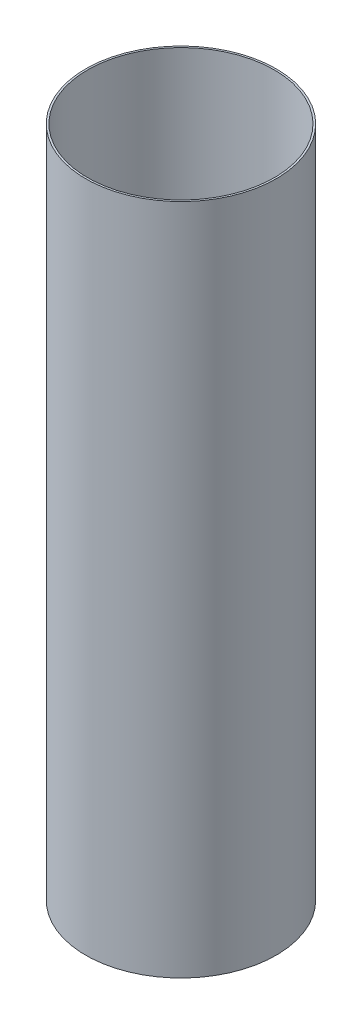
ISO-10303-21;
HEADER;
FILE_DESCRIPTION(('STEP AP214'),'2;1');
FILE_NAME('part.step','',(''),(''),'','','');
FILE_SCHEMA(('AUTOMOTIVE_DESIGN { 1 0 10303 214 1 1 1 1 }'));
ENDSEC;
DATA;
#1=APPLICATION_CONTEXT('core data for automotive mechanical design processes');
#2=APPLICATION_PROTOCOL_DEFINITION('international standard','automotive_design',2000,#1);
#3=PRODUCT_CONTEXT('',#1,'mechanical');
#4=PRODUCT('Part','Part','',(#3));
#5=PRODUCT_RELATED_PRODUCT_CATEGORY('part','',(#4));
#6=PRODUCT_DEFINITION_FORMATION('','',#4);
#7=PRODUCT_DEFINITION_CONTEXT('part definition',#1,'design');
#8=PRODUCT_DEFINITION('design','',#6,#7);
#9=PRODUCT_DEFINITION_SHAPE('','',#8);
#10=(LENGTH_UNIT() NAMED_UNIT(*) SI_UNIT(.MILLI.,.METRE.));
#11=(NAMED_UNIT(*) PLANE_ANGLE_UNIT() SI_UNIT($,.RADIAN.));
#12=(NAMED_UNIT(*) SI_UNIT($,.STERADIAN.) SOLID_ANGLE_UNIT());
#13=UNCERTAINTY_MEASURE_WITH_UNIT(LENGTH_MEASURE(1.E-05),#10,'distance_accuracy_value','');
#14=(GEOMETRIC_REPRESENTATION_CONTEXT(3) GLOBAL_UNCERTAINTY_ASSIGNED_CONTEXT((#13)) GLOBAL_UNIT_ASSIGNED_CONTEXT((#10,
#11,#12)) REPRESENTATION_CONTEXT('',''));
#15=CARTESIAN_POINT('',(0.,0.,0.));
#16=DIRECTION('',(0.,0.,1.));
#17=DIRECTION('',(1.,0.,0.));
#18=AXIS2_PLACEMENT_3D('',#15,#16,#17);
#19=CARTESIAN_POINT('',(0.,360.,0.));
#20=DIRECTION('',(0.,1.,0.));
#21=DIRECTION('',(0.,0.,1.));
#22=AXIS2_PLACEMENT_3D('',#19,#20,#21);
#23=PLANE('',#22);
#24=CARTESIAN_POINT('',(0.,360.,0.));
#25=DIRECTION('',(0.,1.,0.));
#26=DIRECTION('',(0.,0.,1.));
#27=AXIS2_PLACEMENT_3D('',#24,#25,#26);
#28=CIRCLE('',#27,51.);
#29=CARTESIAN_POINT('',(0.,360.,-51.));
#30=VERTEX_POINT('',#29);
#31=EDGE_CURVE('E10',#30,#30,#28,.T.);
#32=ORIENTED_EDGE('',*,*,#31,.T.);
#33=EDGE_LOOP('',(#32));
#34=FACE_BOUND('',#33,.T.);
#35=CARTESIAN_POINT('',(0.,360.,0.));
#36=DIRECTION('',(0.,1.,0.));
#37=DIRECTION('',(0.,0.,1.));
#38=AXIS2_PLACEMENT_3D('',#35,#36,#37);
#39=CIRCLE('',#38,50.);
#40=CARTESIAN_POINT('',(0.,360.,-50.));
#41=VERTEX_POINT('',#40);
#42=EDGE_CURVE('E45',#41,#41,#39,.T.);
#43=ORIENTED_EDGE('',*,*,#42,.F.);
#44=EDGE_LOOP('',(#43));
#45=FACE_BOUND('',#44,.T.);
#46=ADVANCED_FACE('F34',(#34,#45),#23,.T.);
#47=CARTESIAN_POINT('',(0.,0.,0.));
#48=DIRECTION('',(0.,1.,0.));
#49=DIRECTION('',(0.,0.,1.));
#50=AXIS2_PLACEMENT_3D('',#47,#48,#49);
#51=PLANE('',#50);
#52=CARTESIAN_POINT('',(0.,0.,0.));
#53=DIRECTION('',(0.,1.,0.));
#54=DIRECTION('',(0.,0.,1.));
#55=AXIS2_PLACEMENT_3D('',#52,#53,#54);
#56=CIRCLE('',#55,51.);
#57=CARTESIAN_POINT('',(0.,0.,-51.));
#58=VERTEX_POINT('',#57);
#59=EDGE_CURVE('E38',#58,#58,#56,.T.);
#60=ORIENTED_EDGE('',*,*,#59,.F.);
#61=EDGE_LOOP('',(#60));
#62=FACE_BOUND('',#61,.T.);
#63=CARTESIAN_POINT('',(0.,0.,0.));
#64=DIRECTION('',(0.,1.,0.));
#65=DIRECTION('',(0.,0.,1.));
#66=AXIS2_PLACEMENT_3D('',#63,#64,#65);
#67=CIRCLE('',#66,50.);
#68=CARTESIAN_POINT('',(0.,0.,-50.));
#69=VERTEX_POINT('',#68);
#70=EDGE_CURVE('E47',#69,#69,#67,.T.);
#71=ORIENTED_EDGE('',*,*,#70,.T.);
#72=EDGE_LOOP('',(#71));
#73=FACE_BOUND('',#72,.T.);
#74=ADVANCED_FACE('F57',(#62,#73),#51,.F.);
#75=CARTESIAN_POINT('',(0.,360.,0.));
#76=DIRECTION('',(0.,-1.,0.));
#77=DIRECTION('',(0.,0.,-1.));
#78=AXIS2_PLACEMENT_3D('',#75,#76,#77);
#79=CYLINDRICAL_SURFACE('',#78,51.);
#80=CARTESIAN_POINT('',(0.,360.,-51.));
#81=CARTESIAN_POINT('',(0.,356.25,-51.));
#82=CARTESIAN_POINT('',(0.,352.5,-51.));
#83=CARTESIAN_POINT('',(0.,345.,-51.));
#84=CARTESIAN_POINT('',(0.,341.25,-51.));
#85=CARTESIAN_POINT('',(0.,333.75,-51.));
#86=CARTESIAN_POINT('',(0.,330.,-51.));
#87=CARTESIAN_POINT('',(0.,322.5,-51.));
#88=CARTESIAN_POINT('',(0.,318.75,-51.));
#89=CARTESIAN_POINT('',(0.,311.25,-51.));
#90=CARTESIAN_POINT('',(0.,307.5,-51.));
#91=CARTESIAN_POINT('',(0.,300.,-51.));
#92=CARTESIAN_POINT('',(0.,296.25,-51.));
#93=CARTESIAN_POINT('',(0.,288.75,-51.));
#94=CARTESIAN_POINT('',(0.,285.,-51.));
#95=CARTESIAN_POINT('',(0.,277.5,-51.));
#96=CARTESIAN_POINT('',(0.,273.75,-51.));
#97=CARTESIAN_POINT('',(0.,266.25,-51.));
#98=CARTESIAN_POINT('',(0.,262.5,-51.));
#99=CARTESIAN_POINT('',(0.,255.,-51.));
#100=CARTESIAN_POINT('',(0.,251.25,-51.));
#101=CARTESIAN_POINT('',(0.,243.75,-51.));
#102=CARTESIAN_POINT('',(0.,240.,-51.));
#103=CARTESIAN_POINT('',(0.,232.5,-51.));
#104=CARTESIAN_POINT('',(0.,228.75,-51.));
#105=CARTESIAN_POINT('',(0.,221.25,-51.));
#106=CARTESIAN_POINT('',(0.,217.5,-51.));
#107=CARTESIAN_POINT('',(0.,210.,-51.));
#108=CARTESIAN_POINT('',(0.,206.25,-51.));
#109=CARTESIAN_POINT('',(0.,198.75,-51.));
#110=CARTESIAN_POINT('',(0.,195.,-51.));
#111=CARTESIAN_POINT('',(0.,187.5,-51.));
#112=CARTESIAN_POINT('',(0.,183.75,-51.));
#113=CARTESIAN_POINT('',(0.,176.25,-51.));
#114=CARTESIAN_POINT('',(0.,172.5,-51.));
#115=CARTESIAN_POINT('',(0.,165.,-51.));
#116=CARTESIAN_POINT('',(0.,161.25,-51.));
#117=CARTESIAN_POINT('',(0.,153.75,-51.));
#118=CARTESIAN_POINT('',(0.,150.,-51.));
#119=CARTESIAN_POINT('',(0.,142.5,-51.));
#120=CARTESIAN_POINT('',(0.,138.75,-51.));
#121=CARTESIAN_POINT('',(0.,131.25,-51.));
#122=CARTESIAN_POINT('',(0.,127.5,-51.));
#123=CARTESIAN_POINT('',(0.,120.,-51.));
#124=CARTESIAN_POINT('',(0.,116.25,-51.));
#125=CARTESIAN_POINT('',(0.,108.75,-51.));
#126=CARTESIAN_POINT('',(0.,105.,-51.));
#127=CARTESIAN_POINT('',(0.,97.5,-51.));
#128=CARTESIAN_POINT('',(0.,93.75,-51.));
#129=CARTESIAN_POINT('',(0.,86.25,-51.));
#130=CARTESIAN_POINT('',(0.,82.4999999999999,-51.));
#131=CARTESIAN_POINT('',(0.,74.9999999999999,-51.));
#132=CARTESIAN_POINT('',(0.,71.2499999999999,-51.));
#133=CARTESIAN_POINT('',(0.,63.75,-51.));
#134=CARTESIAN_POINT('',(0.,60.,-51.));
#135=CARTESIAN_POINT('',(0.,52.5,-51.));
#136=CARTESIAN_POINT('',(0.,48.7499999999999,-51.));
#137=CARTESIAN_POINT('',(0.,41.2499999999999,-51.));
#138=CARTESIAN_POINT('',(0.,37.4999999999999,-51.));
#139=CARTESIAN_POINT('',(0.,30.,-51.));
#140=CARTESIAN_POINT('',(0.,26.25,-51.));
#141=CARTESIAN_POINT('',(0.,18.75,-51.));
#142=CARTESIAN_POINT('',(0.,14.9999999999999,-51.));
#143=CARTESIAN_POINT('',(0.,7.49999999999993,-51.));
#144=CARTESIAN_POINT('',(0.,3.74999999999994,-51.));
#145=CARTESIAN_POINT('',(0.,0.,-51.));
#146=B_SPLINE_CURVE_WITH_KNOTS('',3,(#80,#81,#82,#83,#84,#85,#86,#87,#88,#89,#90,#91,#92,#93,
#94,#95,#96,#97,#98,#99,#100,#101,#102,#103,#104,#105,#106,#107,#108,#109,#110,#111,#112,#113,
#114,#115,#116,#117,#118,#119,#120,#121,#122,#123,#124,#125,#126,#127,#128,#129,#130,#131,#132,
#133,#134,#135,#136,#137,#138,#139,#140,#141,#142,#143,#144,#145),.UNSPECIFIED.,.F.,.F.,(4,2,2,
2,2,2,2,2,2,2,2,2,2,2,2,2,2,2,2,2,2,2,2,2,2,2,2,2,2,2,2,2,4),(0.,11.25,22.5,33.7499999999999,
45.,56.25,67.4999999999999,78.75,90.,101.25,112.5,123.75,135.,146.25,157.5,168.75,180.,191.25,
202.5,213.75,225.,236.25,247.5,258.75,270.,281.25,292.5,303.75,315.,326.25,337.5,348.75,360.),.UNSPECIFIED.);
#147=EDGE_CURVE('BSEAM36',#30,#58,#146,.T.);
#148=ORIENTED_EDGE('',*,*,#31,.F.);
#149=ORIENTED_EDGE('',*,*,#59,.T.);
#150=ORIENTED_EDGE('',*,*,#147,.T.);
#151=ORIENTED_EDGE('',*,*,#147,.F.);
#152=EDGE_LOOP('',(#148,#150,#149,#151));
#153=FACE_BOUND('',#152,.T.);
#154=ADVANCED_FACE('F36',(#153),#79,.T.);
#155=CARTESIAN_POINT('',(0.,360.,0.));
#156=DIRECTION('',(0.,-1.,0.));
#157=DIRECTION('',(0.,0.,-1.));
#158=AXIS2_PLACEMENT_3D('',#155,#156,#157);
#159=CYLINDRICAL_SURFACE('',#158,50.);
#160=CARTESIAN_POINT('',(0.,360.,-50.));
#161=CARTESIAN_POINT('',(0.,356.25,-50.));
#162=CARTESIAN_POINT('',(0.,352.5,-50.));
#163=CARTESIAN_POINT('',(0.,345.,-50.));
#164=CARTESIAN_POINT('',(0.,341.25,-50.));
#165=CARTESIAN_POINT('',(0.,333.75,-50.));
#166=CARTESIAN_POINT('',(0.,330.,-50.));
#167=CARTESIAN_POINT('',(0.,322.5,-50.));
#168=CARTESIAN_POINT('',(0.,318.75,-50.));
#169=CARTESIAN_POINT('',(0.,311.25,-50.));
#170=CARTESIAN_POINT('',(0.,307.5,-50.));
#171=CARTESIAN_POINT('',(0.,300.,-50.));
#172=CARTESIAN_POINT('',(0.,296.25,-50.));
#173=CARTESIAN_POINT('',(0.,288.75,-50.));
#174=CARTESIAN_POINT('',(0.,285.,-50.));
#175=CARTESIAN_POINT('',(0.,277.5,-50.));
#176=CARTESIAN_POINT('',(0.,273.75,-50.));
#177=CARTESIAN_POINT('',(0.,266.25,-50.));
#178=CARTESIAN_POINT('',(0.,262.5,-50.));
#179=CARTESIAN_POINT('',(0.,255.,-50.));
#180=CARTESIAN_POINT('',(0.,251.25,-50.));
#181=CARTESIAN_POINT('',(0.,243.75,-50.));
#182=CARTESIAN_POINT('',(0.,240.,-50.));
#183=CARTESIAN_POINT('',(0.,232.5,-50.));
#184=CARTESIAN_POINT('',(0.,228.75,-50.));
#185=CARTESIAN_POINT('',(0.,221.25,-50.));
#186=CARTESIAN_POINT('',(0.,217.5,-50.));
#187=CARTESIAN_POINT('',(0.,210.,-50.));
#188=CARTESIAN_POINT('',(0.,206.25,-50.));
#189=CARTESIAN_POINT('',(0.,198.75,-50.));
#190=CARTESIAN_POINT('',(0.,195.,-50.));
#191=CARTESIAN_POINT('',(0.,187.5,-50.));
#192=CARTESIAN_POINT('',(0.,183.75,-50.));
#193=CARTESIAN_POINT('',(0.,176.25,-50.));
#194=CARTESIAN_POINT('',(0.,172.5,-50.));
#195=CARTESIAN_POINT('',(0.,165.,-50.));
#196=CARTESIAN_POINT('',(0.,161.25,-50.));
#197=CARTESIAN_POINT('',(0.,153.75,-50.));
#198=CARTESIAN_POINT('',(0.,150.,-50.));
#199=CARTESIAN_POINT('',(0.,142.5,-50.));
#200=CARTESIAN_POINT('',(0.,138.75,-50.));
#201=CARTESIAN_POINT('',(0.,131.25,-50.));
#202=CARTESIAN_POINT('',(0.,127.5,-50.));
#203=CARTESIAN_POINT('',(0.,120.,-50.));
#204=CARTESIAN_POINT('',(0.,116.25,-50.));
#205=CARTESIAN_POINT('',(0.,108.75,-50.));
#206=CARTESIAN_POINT('',(0.,105.,-50.));
#207=CARTESIAN_POINT('',(0.,97.5,-50.));
#208=CARTESIAN_POINT('',(0.,93.75,-50.));
#209=CARTESIAN_POINT('',(0.,86.25,-50.));
#210=CARTESIAN_POINT('',(0.,82.5,-50.));
#211=CARTESIAN_POINT('',(0.,75.,-50.));
#212=CARTESIAN_POINT('',(0.,71.25,-50.));
#213=CARTESIAN_POINT('',(0.,63.75,-50.));
#214=CARTESIAN_POINT('',(0.,60.,-50.));
#215=CARTESIAN_POINT('',(0.,52.5,-50.));
#216=CARTESIAN_POINT('',(0.,48.75,-50.));
#217=CARTESIAN_POINT('',(0.,41.25,-50.));
#218=CARTESIAN_POINT('',(0.,37.5,-50.));
#219=CARTESIAN_POINT('',(0.,30.,-50.));
#220=CARTESIAN_POINT('',(0.,26.25,-50.));
#221=CARTESIAN_POINT('',(0.,18.75,-50.));
#222=CARTESIAN_POINT('',(0.,14.9999999999999,-50.));
#223=CARTESIAN_POINT('',(0.,7.49999999999993,-50.));
#224=CARTESIAN_POINT('',(0.,3.74999999999994,-50.));
#225=CARTESIAN_POINT('',(0.,0.,-50.));
#226=B_SPLINE_CURVE_WITH_KNOTS('',3,(#160,#161,#162,#163,#164,#165,#166,#167,#168,#169,#170,
#171,#172,#173,#174,#175,#176,#177,#178,#179,#180,#181,#182,#183,#184,#185,#186,#187,#188,#189,
#190,#191,#192,#193,#194,#195,#196,#197,#198,#199,#200,#201,#202,#203,#204,#205,#206,#207,#208,
#209,#210,#211,#212,#213,#214,#215,#216,#217,#218,#219,#220,#221,#222,#223,#224,#225),
.UNSPECIFIED.,.F.,.F.,(4,2,2,2,2,2,2,2,2,2,2,2,2,2,2,2,2,2,2,2,2,2,2,2,2,2,2,2,2,2,2,2,4),(0.,
11.25,22.5,33.7500000000001,45.,56.25,67.5,78.75,90.,101.25,112.5,123.75,135.,146.25,157.5,
168.75,180.,191.25,202.5,213.75,225.,236.25,247.5,258.75,270.,281.25,292.5,303.75,315.,326.25,
337.5,348.75,360.),.UNSPECIFIED.);
#227=EDGE_CURVE('BSEAM53',#41,#69,#226,.T.);
#228=ORIENTED_EDGE('',*,*,#42,.T.);
#229=ORIENTED_EDGE('',*,*,#70,.F.);
#230=ORIENTED_EDGE('',*,*,#227,.T.);
#231=ORIENTED_EDGE('',*,*,#227,.F.);
#232=EDGE_LOOP('',(#228,#230,#229,#231));
#233=FACE_BOUND('',#232,.T.);
#234=ADVANCED_FACE('F53',(#233),#159,.F.);
#235=CLOSED_SHELL('',(#46,#74,#154,#234));
#236=MANIFOLD_SOLID_BREP('B2',#235);
#237=ADVANCED_BREP_SHAPE_REPRESENTATION('',(#18,#236),#14);
#238=SHAPE_DEFINITION_REPRESENTATION(#9,#237);
ENDSEC;
END-ISO-10303-21;
